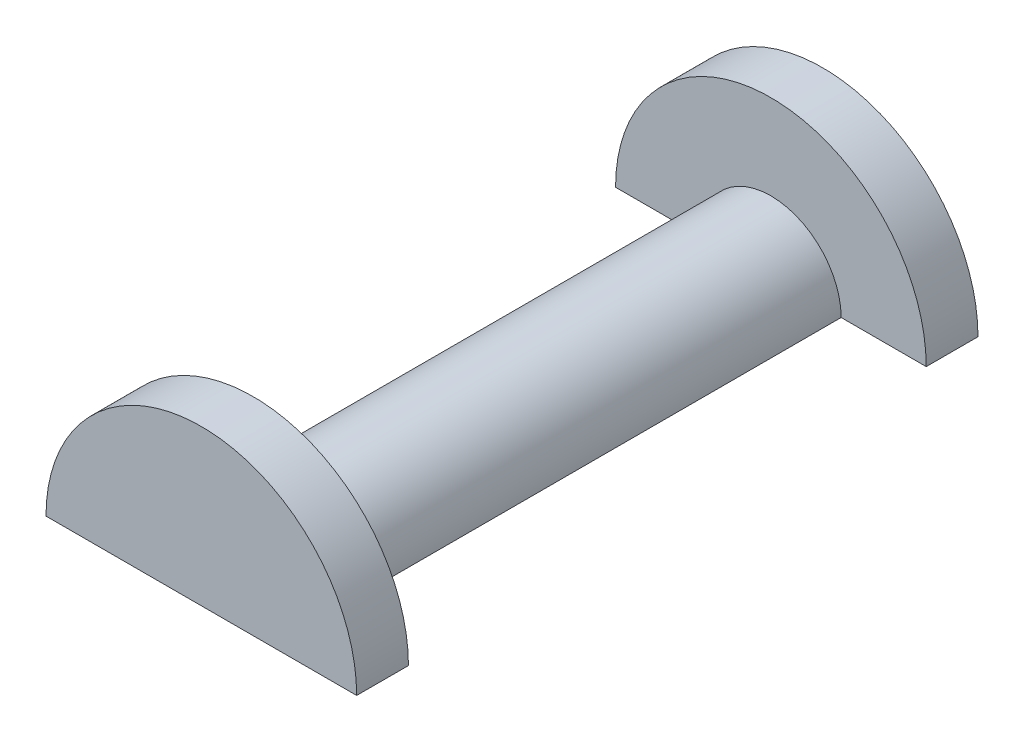
ISO-10303-21;
HEADER;
FILE_DESCRIPTION(('STEP AP214'),'2;1');
FILE_NAME('part.step','',(''),(''),'','','');
FILE_SCHEMA(('AUTOMOTIVE_DESIGN { 1 0 10303 214 1 1 1 1 }'));
ENDSEC;
DATA;
#1=APPLICATION_CONTEXT('core data for automotive mechanical design processes');
#2=APPLICATION_PROTOCOL_DEFINITION('international standard','automotive_design',2000,#1);
#3=PRODUCT_CONTEXT('',#1,'mechanical');
#4=PRODUCT('Part','Part','',(#3));
#5=PRODUCT_RELATED_PRODUCT_CATEGORY('part','',(#4));
#6=PRODUCT_DEFINITION_FORMATION('','',#4);
#7=PRODUCT_DEFINITION_CONTEXT('part definition',#1,'design');
#8=PRODUCT_DEFINITION('design','',#6,#7);
#9=PRODUCT_DEFINITION_SHAPE('','',#8);
#10=(LENGTH_UNIT() NAMED_UNIT(*) SI_UNIT(.MILLI.,.METRE.));
#11=(NAMED_UNIT(*) PLANE_ANGLE_UNIT() SI_UNIT($,.RADIAN.));
#12=(NAMED_UNIT(*) SI_UNIT($,.STERADIAN.) SOLID_ANGLE_UNIT());
#13=UNCERTAINTY_MEASURE_WITH_UNIT(LENGTH_MEASURE(1.E-05),#10,'distance_accuracy_value','');
#14=(GEOMETRIC_REPRESENTATION_CONTEXT(3) GLOBAL_UNCERTAINTY_ASSIGNED_CONTEXT((#13)) GLOBAL_UNIT_ASSIGNED_CONTEXT((#10,
#11,#12)) REPRESENTATION_CONTEXT('',''));
#15=CARTESIAN_POINT('',(0.,0.,0.));
#16=DIRECTION('',(0.,0.,1.));
#17=DIRECTION('',(1.,0.,0.));
#18=AXIS2_PLACEMENT_3D('',#15,#16,#17);
#19=CARTESIAN_POINT('',(0.,0.,-20.));
#20=DIRECTION('',(0.,0.,1.));
#21=DIRECTION('',(1.,0.,0.));
#22=AXIS2_PLACEMENT_3D('',#19,#20,#21);
#23=CYLINDRICAL_SURFACE('',#22,30.);
#24=DIRECTION('',(0.,0.,1.));
#25=VECTOR('',#24,1.);
#26=CARTESIAN_POINT('',(30.,0.,-20.));
#27=LINE('',#26,#25);
#28=CARTESIAN_POINT('',(30.,0.,-20.));
#29=VERTEX_POINT('',#28);
#30=CARTESIAN_POINT('',(30.,0.,-10.));
#31=VERTEX_POINT('',#30);
#32=EDGE_CURVE('E84',#29,#31,#27,.T.);
#33=ORIENTED_EDGE('',*,*,#32,.F.);
#34=CARTESIAN_POINT('',(0.,0.,-20.));
#35=DIRECTION('',(0.,0.,-1.));
#36=DIRECTION('',(-1.,0.,0.));
#37=AXIS2_PLACEMENT_3D('',#34,#35,#36);
#38=CIRCLE('',#37,30.);
#39=CARTESIAN_POINT('',(-30.,0.,-20.));
#40=VERTEX_POINT('',#39);
#41=EDGE_CURVE('E92',#40,#29,#38,.T.);
#42=ORIENTED_EDGE('',*,*,#41,.F.);
#43=DIRECTION('',(0.,0.,1.));
#44=VECTOR('',#43,1.);
#45=CARTESIAN_POINT('',(-30.,0.,-20.));
#46=LINE('',#45,#44);
#47=CARTESIAN_POINT('',(-30.,0.,-10.));
#48=VERTEX_POINT('',#47);
#49=EDGE_CURVE('E52',#48,#40,#46,.F.);
#50=ORIENTED_EDGE('',*,*,#49,.F.);
#51=CARTESIAN_POINT('',(0.,0.,-10.));
#52=DIRECTION('',(0.,0.,-1.));
#53=DIRECTION('',(-1.,0.,0.));
#54=AXIS2_PLACEMENT_3D('',#51,#52,#53);
#55=CIRCLE('',#54,30.);
#56=EDGE_CURVE('E45',#48,#31,#55,.T.);
#57=ORIENTED_EDGE('',*,*,#56,.T.);
#58=EDGE_LOOP('',(#33,#42,#50,#57));
#59=FACE_BOUND('',#58,.T.);
#60=ADVANCED_FACE('F32',(#59),#23,.T.);
#61=CARTESIAN_POINT('',(0.,0.,-20.));
#62=DIRECTION('',(0.,0.,-1.));
#63=DIRECTION('',(-1.,0.,0.));
#64=AXIS2_PLACEMENT_3D('',#61,#62,#63);
#65=PLANE('',#64);
#66=ORIENTED_EDGE('',*,*,#41,.T.);
#67=DIRECTION('',(-1.,0.,0.));
#68=VECTOR('',#67,1.);
#69=CARTESIAN_POINT('',(0.,0.,-20.));
#70=LINE('',#69,#68);
#71=CARTESIAN_POINT('',(13.571470999608,0.,-20.));
#72=VERTEX_POINT('',#71);
#73=EDGE_CURVE('E87',#29,#72,#70,.T.);
#74=ORIENTED_EDGE('',*,*,#73,.T.);
#75=CARTESIAN_POINT('',(0.,0.,-20.));
#76=DIRECTION('',(0.,0.,-1.));
#77=DIRECTION('',(-1.,0.,0.));
#78=AXIS2_PLACEMENT_3D('',#75,#76,#77);
#79=CIRCLE('',#78,13.571470999608);
#80=CARTESIAN_POINT('',(-13.571470999608,0.,-20.));
#81=VERTEX_POINT('',#80);
#82=EDGE_CURVE('E94',#81,#72,#79,.T.);
#83=ORIENTED_EDGE('',*,*,#82,.F.);
#84=EDGE_CURVE('E96',#81,#40,#70,.T.);
#85=ORIENTED_EDGE('',*,*,#84,.T.);
#86=EDGE_LOOP('',(#66,#74,#83,#85));
#87=FACE_BOUND('',#86,.T.);
#88=ADVANCED_FACE('F115',(#87),#65,.T.);
#89=CARTESIAN_POINT('',(0.,0.,-130.));
#90=DIRECTION('',(0.,0.,-1.));
#91=DIRECTION('',(-1.,0.,0.));
#92=AXIS2_PLACEMENT_3D('',#89,#90,#91);
#93=PLANE('',#92);
#94=CARTESIAN_POINT('',(0.,0.,-130.));
#95=DIRECTION('',(0.,0.,-1.));
#96=DIRECTION('',(-1.,0.,0.));
#97=AXIS2_PLACEMENT_3D('',#94,#95,#96);
#98=CIRCLE('',#97,30.);
#99=CARTESIAN_POINT('',(-30.,0.,-130.));
#100=VERTEX_POINT('',#99);
#101=CARTESIAN_POINT('',(30.,0.,-130.));
#102=VERTEX_POINT('',#101);
#103=EDGE_CURVE('E102',#100,#102,#98,.T.);
#104=ORIENTED_EDGE('',*,*,#103,.T.);
#105=DIRECTION('',(-1.,0.,0.));
#106=VECTOR('',#105,1.);
#107=CARTESIAN_POINT('',(0.,0.,-130.));
#108=LINE('',#107,#106);
#109=EDGE_CURVE('E127',#102,#100,#108,.T.);
#110=ORIENTED_EDGE('',*,*,#109,.T.);
#111=EDGE_LOOP('',(#104,#110));
#112=FACE_BOUND('',#111,.T.);
#113=ADVANCED_FACE('F140',(#112),#93,.T.);
#114=CARTESIAN_POINT('',(0.,0.,-120.));
#115=DIRECTION('',(0.,0.,-1.));
#116=DIRECTION('',(-1.,0.,0.));
#117=AXIS2_PLACEMENT_3D('',#114,#115,#116);
#118=CYLINDRICAL_SURFACE('',#117,30.);
#119=ORIENTED_EDGE('',*,*,#103,.F.);
#120=DIRECTION('',(0.,0.,-1.));
#121=VECTOR('',#120,1.);
#122=CARTESIAN_POINT('',(-30.,0.,-120.));
#123=LINE('',#122,#121);
#124=CARTESIAN_POINT('',(-30.,0.,-120.));
#125=VERTEX_POINT('',#124);
#126=EDGE_CURVE('E122',#100,#125,#123,.F.);
#127=ORIENTED_EDGE('',*,*,#126,.T.);
#128=CARTESIAN_POINT('',(0.,0.,-120.));
#129=DIRECTION('',(0.,0.,-1.));
#130=DIRECTION('',(-1.,0.,0.));
#131=AXIS2_PLACEMENT_3D('',#128,#129,#130);
#132=CIRCLE('',#131,30.);
#133=CARTESIAN_POINT('',(30.,0.,-120.));
#134=VERTEX_POINT('',#133);
#135=EDGE_CURVE('E99',#125,#134,#132,.T.);
#136=ORIENTED_EDGE('',*,*,#135,.T.);
#137=DIRECTION('',(0.,0.,-1.));
#138=VECTOR('',#137,1.);
#139=CARTESIAN_POINT('',(30.,0.,-120.));
#140=LINE('',#139,#138);
#141=EDGE_CURVE('E130',#134,#102,#140,.T.);
#142=ORIENTED_EDGE('',*,*,#141,.T.);
#143=EDGE_LOOP('',(#119,#127,#136,#142));
#144=FACE_BOUND('',#143,.T.);
#145=ADVANCED_FACE('F138',(#144),#118,.T.);
#146=CARTESIAN_POINT('',(0.,0.,-120.));
#147=DIRECTION('',(0.,0.,-1.));
#148=DIRECTION('',(-1.,0.,0.));
#149=AXIS2_PLACEMENT_3D('',#146,#147,#148);
#150=PLANE('',#149);
#151=DIRECTION('',(-1.,0.,0.));
#152=VECTOR('',#151,1.);
#153=CARTESIAN_POINT('',(0.,0.,-120.));
#154=LINE('',#153,#152);
#155=CARTESIAN_POINT('',(13.571470999608,0.,-120.));
#156=VERTEX_POINT('',#155);
#157=EDGE_CURVE('E117',#134,#156,#154,.T.);
#158=ORIENTED_EDGE('',*,*,#157,.F.);
#159=ORIENTED_EDGE('',*,*,#135,.F.);
#160=CARTESIAN_POINT('',(-13.571470999608,0.,-120.));
#161=VERTEX_POINT('',#160);
#162=EDGE_CURVE('E119',#161,#125,#154,.T.);
#163=ORIENTED_EDGE('',*,*,#162,.F.);
#164=CARTESIAN_POINT('',(0.,0.,-120.));
#165=DIRECTION('',(0.,0.,-1.));
#166=DIRECTION('',(-1.,0.,0.));
#167=AXIS2_PLACEMENT_3D('',#164,#165,#166);
#168=CIRCLE('',#167,13.571470999608);
#169=EDGE_CURVE('E40',#161,#156,#168,.T.);
#170=ORIENTED_EDGE('',*,*,#169,.T.);
#171=EDGE_LOOP('',(#158,#159,#163,#170));
#172=FACE_BOUND('',#171,.T.);
#173=ADVANCED_FACE('F135',(#172),#150,.F.);
#174=CARTESIAN_POINT('',(0.,0.,-130.));
#175=DIRECTION('',(0.,0.,1.));
#176=DIRECTION('',(1.,0.,0.));
#177=AXIS2_PLACEMENT_3D('',#174,#175,#176);
#178=CYLINDRICAL_SURFACE('',#177,13.571470999608);
#179=DIRECTION('',(0.,0.,1.));
#180=VECTOR('',#179,1.);
#181=CARTESIAN_POINT('',(13.571470999608,0.,-130.));
#182=LINE('',#181,#180);
#183=EDGE_CURVE('E112',#156,#72,#182,.T.);
#184=ORIENTED_EDGE('',*,*,#183,.F.);
#185=ORIENTED_EDGE('',*,*,#169,.F.);
#186=DIRECTION('',(0.,0.,1.));
#187=VECTOR('',#186,1.);
#188=CARTESIAN_POINT('',(-13.571470999608,0.,-130.));
#189=LINE('',#188,#187);
#190=EDGE_CURVE('E113',#81,#161,#189,.F.);
#191=ORIENTED_EDGE('',*,*,#190,.F.);
#192=ORIENTED_EDGE('',*,*,#82,.T.);
#193=EDGE_LOOP('',(#184,#185,#191,#192));
#194=FACE_BOUND('',#193,.T.);
#195=ADVANCED_FACE('F34',(#194),#178,.T.);
#196=CARTESIAN_POINT('',(81.970464636953,0.,-270.));
#197=DIRECTION('',(0.,-1.,0.));
#198=DIRECTION('',(0.,0.,-1.));
#199=AXIS2_PLACEMENT_3D('',#196,#197,#198);
#200=PLANE('',#199);
#201=DIRECTION('',(1.,0.,0.));
#202=VECTOR('',#201,1.);
#203=CARTESIAN_POINT('',(81.970464636953,0.,-10.));
#204=LINE('',#203,#202);
#205=EDGE_CURVE('E11',#48,#31,#204,.T.);
#206=ORIENTED_EDGE('',*,*,#205,.F.);
#207=ORIENTED_EDGE('',*,*,#49,.T.);
#208=ORIENTED_EDGE('',*,*,#84,.F.);
#209=ORIENTED_EDGE('',*,*,#190,.T.);
#210=ORIENTED_EDGE('',*,*,#162,.T.);
#211=ORIENTED_EDGE('',*,*,#126,.F.);
#212=ORIENTED_EDGE('',*,*,#109,.F.);
#213=ORIENTED_EDGE('',*,*,#141,.F.);
#214=ORIENTED_EDGE('',*,*,#157,.T.);
#215=ORIENTED_EDGE('',*,*,#183,.T.);
#216=ORIENTED_EDGE('',*,*,#73,.F.);
#217=ORIENTED_EDGE('',*,*,#32,.T.);
#218=EDGE_LOOP('',(#206,#207,#208,#209,#210,#211,#212,#213,#214,#215,#216,#217));
#219=FACE_BOUND('',#218,.T.);
#220=ADVANCED_FACE('F85',(#219),#200,.T.);
#221=CARTESIAN_POINT('',(0.,0.,-10.));
#222=DIRECTION('',(0.,0.,-1.));
#223=DIRECTION('',(-1.,0.,0.));
#224=AXIS2_PLACEMENT_3D('',#221,#222,#223);
#225=PLANE('',#224);
#226=ORIENTED_EDGE('',*,*,#205,.T.);
#227=ORIENTED_EDGE('',*,*,#56,.F.);
#228=EDGE_LOOP('',(#226,#227));
#229=FACE_BOUND('',#228,.T.);
#230=ADVANCED_FACE('F82',(#229),#225,.F.);
#231=CLOSED_SHELL('',(#60,#88,#113,#145,#173,#195,#220,#230));
#232=MANIFOLD_SOLID_BREP('B2',#231);
#233=ADVANCED_BREP_SHAPE_REPRESENTATION('',(#18,#232),#14);
#234=SHAPE_DEFINITION_REPRESENTATION(#9,#233);
ENDSEC;
END-ISO-10303-21;
